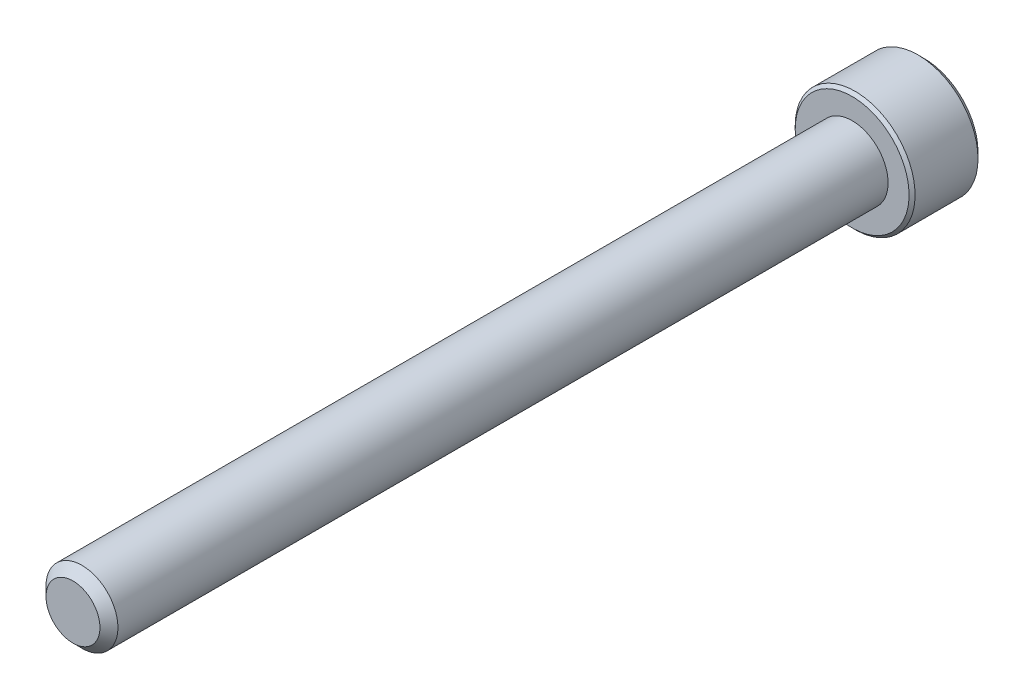
ISO-10303-21;
HEADER;
FILE_DESCRIPTION(('STEP AP214'),'2;1');
FILE_NAME('part.step','',(''),(''),'','','');
FILE_SCHEMA(('AUTOMOTIVE_DESIGN { 1 0 10303 214 1 1 1 1 }'));
ENDSEC;
DATA;
#1=APPLICATION_CONTEXT('core data for automotive mechanical design processes');
#2=APPLICATION_PROTOCOL_DEFINITION('international standard','automotive_design',2000,#1);
#3=PRODUCT_CONTEXT('',#1,'mechanical');
#4=PRODUCT('Part','Part','',(#3));
#5=PRODUCT_RELATED_PRODUCT_CATEGORY('part','',(#4));
#6=PRODUCT_DEFINITION_FORMATION('','',#4);
#7=PRODUCT_DEFINITION_CONTEXT('part definition',#1,'design');
#8=PRODUCT_DEFINITION('design','',#6,#7);
#9=PRODUCT_DEFINITION_SHAPE('','',#8);
#10=(LENGTH_UNIT() NAMED_UNIT(*) SI_UNIT(.MILLI.,.METRE.));
#11=(NAMED_UNIT(*) PLANE_ANGLE_UNIT() SI_UNIT($,.RADIAN.));
#12=(NAMED_UNIT(*) SI_UNIT($,.STERADIAN.) SOLID_ANGLE_UNIT());
#13=UNCERTAINTY_MEASURE_WITH_UNIT(LENGTH_MEASURE(1.E-05),#10,'distance_accuracy_value','');
#14=(GEOMETRIC_REPRESENTATION_CONTEXT(3) GLOBAL_UNCERTAINTY_ASSIGNED_CONTEXT((#13)) GLOBAL_UNIT_ASSIGNED_CONTEXT((#10,
#11,#12)) REPRESENTATION_CONTEXT('',''));
#15=CARTESIAN_POINT('',(0.,0.,0.));
#16=DIRECTION('',(0.,0.,1.));
#17=DIRECTION('',(1.,0.,0.));
#18=AXIS2_PLACEMENT_3D('',#15,#16,#17);
#19=CARTESIAN_POINT('',(0.,4.99999999999999,-35.5));
#20=DIRECTION('',(0.,0.,-1.));
#21=DIRECTION('',(1.,0.,0.));
#22=AXIS2_PLACEMENT_3D('',#19,#20,#21);
#23=PLANE('',#22);
#24=CARTESIAN_POINT('',(0.,0.,-35.5));
#25=DIRECTION('',(0.,0.,1.));
#26=DIRECTION('',(1.,0.,0.));
#27=AXIS2_PLACEMENT_3D('',#24,#25,#26);
#28=CIRCLE('',#27,4.49999999999999);
#29=CARTESIAN_POINT('',(4.49999999999999,0.,-35.5));
#30=VERTEX_POINT('',#29);
#31=EDGE_CURVE('E133',#30,#30,#28,.T.);
#32=ORIENTED_EDGE('',*,*,#31,.F.);
#33=EDGE_LOOP('',(#32));
#34=FACE_BOUND('',#33,.T.);
#35=DIRECTION('',(-0.866025403784439,0.5,0.));
#36=VECTOR('',#35,1.);
#37=CARTESIAN_POINT('',(2.5,1.44337567297406,-35.5));
#38=LINE('',#37,#36);
#39=CARTESIAN_POINT('',(2.5,1.44337567297406,-35.5));
#40=VERTEX_POINT('',#39);
#41=CARTESIAN_POINT('',(0.,2.88675134594813,-35.5));
#42=VERTEX_POINT('',#41);
#43=EDGE_CURVE('E292',#40,#42,#38,.T.);
#44=ORIENTED_EDGE('',*,*,#43,.T.);
#45=DIRECTION('',(-0.866025403784438,-0.5,0.));
#46=VECTOR('',#45,1.);
#47=CARTESIAN_POINT('',(0.,2.88675134594813,-35.5));
#48=LINE('',#47,#46);
#49=CARTESIAN_POINT('',(-2.5,1.44337567297406,-35.5));
#50=VERTEX_POINT('',#49);
#51=EDGE_CURVE('E286',#42,#50,#48,.T.);
#52=ORIENTED_EDGE('',*,*,#51,.T.);
#53=DIRECTION('',(0.,-1.,0.));
#54=VECTOR('',#53,1.);
#55=CARTESIAN_POINT('',(-2.5,1.44337567297406,-35.5));
#56=LINE('',#55,#54);
#57=CARTESIAN_POINT('',(-2.5,-1.44337567297407,-35.5));
#58=VERTEX_POINT('',#57);
#59=EDGE_CURVE('E291',#50,#58,#56,.T.);
#60=ORIENTED_EDGE('',*,*,#59,.T.);
#61=DIRECTION('',(0.866025403784439,-0.5,0.));
#62=VECTOR('',#61,1.);
#63=CARTESIAN_POINT('',(-2.5,-1.44337567297407,-35.5));
#64=LINE('',#63,#62);
#65=CARTESIAN_POINT('',(0.,-2.88675134594813,-35.5));
#66=VERTEX_POINT('',#65);
#67=EDGE_CURVE('E299',#58,#66,#64,.T.);
#68=ORIENTED_EDGE('',*,*,#67,.T.);
#69=DIRECTION('',(0.866025403784439,0.5,0.));
#70=VECTOR('',#69,1.);
#71=CARTESIAN_POINT('',(0.,-2.88675134594813,-35.5));
#72=LINE('',#71,#70);
#73=CARTESIAN_POINT('',(2.5,-1.44337567297407,-35.5));
#74=VERTEX_POINT('',#73);
#75=EDGE_CURVE('E116',#66,#74,#72,.T.);
#76=ORIENTED_EDGE('',*,*,#75,.T.);
#77=DIRECTION('',(0.,1.,0.));
#78=VECTOR('',#77,1.);
#79=CARTESIAN_POINT('',(2.5,-1.44337567297407,-35.5));
#80=LINE('',#79,#78);
#81=EDGE_CURVE('E294',#74,#40,#80,.T.);
#82=ORIENTED_EDGE('',*,*,#81,.T.);
#83=EDGE_LOOP('',(#44,#52,#60,#68,#76,#82));
#84=FACE_BOUND('',#83,.T.);
#85=ADVANCED_FACE('F37',(#34,#84),#23,.T.);
#86=CARTESIAN_POINT('',(0.,0.,35.5));
#87=DIRECTION('',(0.,0.,1.));
#88=DIRECTION('',(-1.,0.,0.));
#89=AXIS2_PLACEMENT_3D('',#86,#87,#88);
#90=CYLINDRICAL_SURFACE('',#89,5.);
#91=CARTESIAN_POINT('',(0.,0.,-29.75));
#92=DIRECTION('',(0.,0.,-1.));
#93=DIRECTION('',(-1.,0.,0.));
#94=AXIS2_PLACEMENT_3D('',#91,#92,#93);
#95=CIRCLE('',#94,5.);
#96=CARTESIAN_POINT('',(-5.,0.,-29.75));
#97=VERTEX_POINT('',#96);
#98=EDGE_CURVE('E139',#97,#97,#95,.F.);
#99=ORIENTED_EDGE('',*,*,#98,.F.);
#100=EDGE_LOOP('',(#99));
#101=FACE_BOUND('',#100,.T.);
#102=CARTESIAN_POINT('',(0.,0.,-35.));
#103=DIRECTION('',(0.,0.,1.));
#104=DIRECTION('',(1.,0.,0.));
#105=AXIS2_PLACEMENT_3D('',#102,#103,#104);
#106=CIRCLE('',#105,5.);
#107=CARTESIAN_POINT('',(5.,0.,-35.));
#108=VERTEX_POINT('',#107);
#109=EDGE_CURVE('E130',#108,#108,#106,.F.);
#110=ORIENTED_EDGE('',*,*,#109,.F.);
#111=EDGE_LOOP('',(#110));
#112=FACE_BOUND('',#111,.T.);
#113=ADVANCED_FACE('F160',(#101,#112),#90,.T.);
#114=CARTESIAN_POINT('',(0.,4.99999999999999,-29.5));
#115=DIRECTION('',(0.,0.,1.));
#116=DIRECTION('',(-1.,0.,0.));
#117=AXIS2_PLACEMENT_3D('',#114,#115,#116);
#118=PLANE('',#117);
#119=CARTESIAN_POINT('',(0.,0.,-29.5));
#120=DIRECTION('',(0.,0.,-1.));
#121=DIRECTION('',(-1.,0.,0.));
#122=AXIS2_PLACEMENT_3D('',#119,#120,#121);
#123=CIRCLE('',#122,4.74999999999998);
#124=CARTESIAN_POINT('',(-4.74999999999998,0.,-29.5));
#125=VERTEX_POINT('',#124);
#126=EDGE_CURVE('E136',#125,#125,#123,.T.);
#127=ORIENTED_EDGE('',*,*,#126,.F.);
#128=EDGE_LOOP('',(#127));
#129=FACE_BOUND('',#128,.T.);
#130=CARTESIAN_POINT('',(0.,0.,-29.5));
#131=DIRECTION('',(0.,0.,-1.));
#132=DIRECTION('',(-1.,0.,0.));
#133=AXIS2_PLACEMENT_3D('',#130,#131,#132);
#134=CIRCLE('',#133,3.);
#135=CARTESIAN_POINT('',(-3.,0.,-29.5));
#136=VERTEX_POINT('',#135);
#137=EDGE_CURVE('E127',#136,#136,#134,.T.);
#138=ORIENTED_EDGE('',*,*,#137,.T.);
#139=EDGE_LOOP('',(#138));
#140=FACE_BOUND('',#139,.T.);
#141=ADVANCED_FACE('F156',(#129,#140),#118,.T.);
#142=CARTESIAN_POINT('',(0.,0.,35.5));
#143=DIRECTION('',(0.,0.,1.));
#144=DIRECTION('',(-1.,0.,0.));
#145=AXIS2_PLACEMENT_3D('',#142,#143,#144);
#146=CYLINDRICAL_SURFACE('',#145,3.);
#147=CARTESIAN_POINT('',(0.,0.,34.75));
#148=DIRECTION('',(0.,0.,-1.));
#149=DIRECTION('',(-1.,0.,0.));
#150=AXIS2_PLACEMENT_3D('',#147,#148,#149);
#151=CIRCLE('',#150,3.);
#152=CARTESIAN_POINT('',(2.99999999999999,0.,34.75));
#153=VERTEX_POINT('',#152);
#154=EDGE_CURVE('E11',#153,#153,#151,.F.);
#155=ORIENTED_EDGE('',*,*,#154,.F.);
#156=EDGE_LOOP('',(#155));
#157=FACE_BOUND('',#156,.T.);
#158=ORIENTED_EDGE('',*,*,#137,.F.);
#159=EDGE_LOOP('',(#158));
#160=FACE_BOUND('',#159,.T.);
#161=ADVANCED_FACE('F148',(#157,#160),#146,.T.);
#162=CARTESIAN_POINT('',(0.,2.99999999999999,35.5));
#163=DIRECTION('',(0.,0.,1.));
#164=DIRECTION('',(-1.,0.,0.));
#165=AXIS2_PLACEMENT_3D('',#162,#163,#164);
#166=PLANE('',#165);
#167=CARTESIAN_POINT('',(0.,0.,35.5));
#168=DIRECTION('',(0.,0.,-1.));
#169=DIRECTION('',(-1.,0.,0.));
#170=AXIS2_PLACEMENT_3D('',#167,#168,#169);
#171=CIRCLE('',#170,2.25000000000001);
#172=CARTESIAN_POINT('',(2.25000000000001,0.,35.5));
#173=VERTEX_POINT('',#172);
#174=EDGE_CURVE('E45',#173,#173,#171,.T.);
#175=ORIENTED_EDGE('',*,*,#174,.F.);
#176=EDGE_LOOP('',(#175));
#177=FACE_BOUND('',#176,.T.);
#178=ADVANCED_FACE('F145',(#177),#166,.T.);
#179=CARTESIAN_POINT('',(2.5,1.44337567297406,-31.75));
#180=DIRECTION('',(0.5,0.866025403784439,0.));
#181=DIRECTION('',(-0.866025403784439,0.5,0.));
#182=AXIS2_PLACEMENT_3D('',#179,#180,#181);
#183=PLANE('',#182);
#184=ORIENTED_EDGE('',*,*,#43,.F.);
#185=DIRECTION('',(0.,0.,-1.));
#186=VECTOR('',#185,1.);
#187=CARTESIAN_POINT('',(2.5,1.44337567297406,-31.75));
#188=LINE('',#187,#186);
#189=CARTESIAN_POINT('',(2.5,1.44337567297406,-31.75));
#190=VERTEX_POINT('',#189);
#191=EDGE_CURVE('E83',#190,#40,#188,.T.);
#192=ORIENTED_EDGE('',*,*,#191,.F.);
#193=DIRECTION('',(-0.866025403784439,0.5,0.));
#194=VECTOR('',#193,1.);
#195=CARTESIAN_POINT('',(2.5,1.44337567297406,-31.75));
#196=LINE('',#195,#194);
#197=CARTESIAN_POINT('',(0.,2.88675134594813,-31.75));
#198=VERTEX_POINT('',#197);
#199=EDGE_CURVE('E302',#190,#198,#196,.T.);
#200=ORIENTED_EDGE('',*,*,#199,.T.);
#201=DIRECTION('',(0.,0.,-1.));
#202=VECTOR('',#201,1.);
#203=CARTESIAN_POINT('',(0.,2.88675134594813,-31.75));
#204=LINE('',#203,#202);
#205=EDGE_CURVE('E52',#198,#42,#204,.T.);
#206=ORIENTED_EDGE('',*,*,#205,.T.);
#207=EDGE_LOOP('',(#184,#192,#200,#206));
#208=FACE_BOUND('',#207,.T.);
#209=ADVANCED_FACE('F147',(#208),#183,.F.);
#210=CARTESIAN_POINT('',(2.5,-1.44337567297407,-31.75));
#211=DIRECTION('',(1.,0.,0.));
#212=DIRECTION('',(0.,0.,1.));
#213=AXIS2_PLACEMENT_3D('',#210,#211,#212);
#214=PLANE('',#213);
#215=ORIENTED_EDGE('',*,*,#81,.F.);
#216=DIRECTION('',(0.,0.,-1.));
#217=VECTOR('',#216,1.);
#218=CARTESIAN_POINT('',(2.5,-1.44337567297407,-31.75));
#219=LINE('',#218,#217);
#220=CARTESIAN_POINT('',(2.5,-1.44337567297407,-31.75));
#221=VERTEX_POINT('',#220);
#222=EDGE_CURVE('E118',#221,#74,#219,.T.);
#223=ORIENTED_EDGE('',*,*,#222,.F.);
#224=DIRECTION('',(0.,1.,0.));
#225=VECTOR('',#224,1.);
#226=CARTESIAN_POINT('',(2.5,-1.44337567297407,-31.75));
#227=LINE('',#226,#225);
#228=EDGE_CURVE('E61',#221,#190,#227,.T.);
#229=ORIENTED_EDGE('',*,*,#228,.T.);
#230=ORIENTED_EDGE('',*,*,#191,.T.);
#231=EDGE_LOOP('',(#215,#223,#229,#230));
#232=FACE_BOUND('',#231,.T.);
#233=ADVANCED_FACE('F154',(#232),#214,.F.);
#234=CARTESIAN_POINT('',(0.,-2.88675134594813,-31.75));
#235=DIRECTION('',(0.5,-0.866025403784439,0.));
#236=DIRECTION('',(0.866025403784439,0.5,0.));
#237=AXIS2_PLACEMENT_3D('',#234,#235,#236);
#238=PLANE('',#237);
#239=ORIENTED_EDGE('',*,*,#75,.F.);
#240=DIRECTION('',(0.,0.,-1.));
#241=VECTOR('',#240,1.);
#242=CARTESIAN_POINT('',(0.,-2.88675134594813,-31.75));
#243=LINE('',#242,#241);
#244=CARTESIAN_POINT('',(0.,-2.88675134594813,-31.75));
#245=VERTEX_POINT('',#244);
#246=EDGE_CURVE('E105',#245,#66,#243,.T.);
#247=ORIENTED_EDGE('',*,*,#246,.F.);
#248=DIRECTION('',(0.866025403784439,0.5,0.));
#249=VECTOR('',#248,1.);
#250=CARTESIAN_POINT('',(0.,-2.88675134594813,-31.75));
#251=LINE('',#250,#249);
#252=EDGE_CURVE('E108',#245,#221,#251,.T.);
#253=ORIENTED_EDGE('',*,*,#252,.T.);
#254=ORIENTED_EDGE('',*,*,#222,.T.);
#255=EDGE_LOOP('',(#239,#247,#253,#254));
#256=FACE_BOUND('',#255,.T.);
#257=ADVANCED_FACE('F114',(#256),#238,.F.);
#258=CARTESIAN_POINT('',(-2.5,-1.44337567297407,-31.75));
#259=DIRECTION('',(-0.5,-0.866025403784439,0.));
#260=DIRECTION('',(0.866025403784439,-0.5,0.));
#261=AXIS2_PLACEMENT_3D('',#258,#259,#260);
#262=PLANE('',#261);
#263=ORIENTED_EDGE('',*,*,#67,.F.);
#264=DIRECTION('',(0.,0.,-1.));
#265=VECTOR('',#264,1.);
#266=CARTESIAN_POINT('',(-2.5,-1.44337567297407,-31.75));
#267=LINE('',#266,#265);
#268=CARTESIAN_POINT('',(-2.5,-1.44337567297407,-31.75));
#269=VERTEX_POINT('',#268);
#270=EDGE_CURVE('E107',#269,#58,#267,.T.);
#271=ORIENTED_EDGE('',*,*,#270,.F.);
#272=DIRECTION('',(0.866025403784439,-0.5,0.));
#273=VECTOR('',#272,1.);
#274=CARTESIAN_POINT('',(-2.5,-1.44337567297407,-31.75));
#275=LINE('',#274,#273);
#276=EDGE_CURVE('E100',#269,#245,#275,.T.);
#277=ORIENTED_EDGE('',*,*,#276,.T.);
#278=ORIENTED_EDGE('',*,*,#246,.T.);
#279=EDGE_LOOP('',(#263,#271,#277,#278));
#280=FACE_BOUND('',#279,.T.);
#281=ADVANCED_FACE('F103',(#280),#262,.F.);
#282=CARTESIAN_POINT('',(-2.5,1.44337567297406,-31.75));
#283=DIRECTION('',(-1.,0.,0.));
#284=DIRECTION('',(0.,-1.,0.));
#285=AXIS2_PLACEMENT_3D('',#282,#283,#284);
#286=PLANE('',#285);
#287=ORIENTED_EDGE('',*,*,#59,.F.);
#288=DIRECTION('',(0.,0.,-1.));
#289=VECTOR('',#288,1.);
#290=CARTESIAN_POINT('',(-2.5,1.44337567297406,-31.75));
#291=LINE('',#290,#289);
#292=CARTESIAN_POINT('',(-2.5,1.44337567297406,-31.75));
#293=VERTEX_POINT('',#292);
#294=EDGE_CURVE('E121',#293,#50,#291,.T.);
#295=ORIENTED_EDGE('',*,*,#294,.F.);
#296=DIRECTION('',(0.,-1.,0.));
#297=VECTOR('',#296,1.);
#298=CARTESIAN_POINT('',(-2.5,1.44337567297406,-31.75));
#299=LINE('',#298,#297);
#300=EDGE_CURVE('E109',#293,#269,#299,.T.);
#301=ORIENTED_EDGE('',*,*,#300,.T.);
#302=ORIENTED_EDGE('',*,*,#270,.T.);
#303=EDGE_LOOP('',(#287,#295,#301,#302));
#304=FACE_BOUND('',#303,.T.);
#305=ADVANCED_FACE('F252',(#304),#286,.F.);
#306=CARTESIAN_POINT('',(0.,2.88675134594813,-31.75));
#307=DIRECTION('',(-0.5,0.866025403784438,0.));
#308=DIRECTION('',(-0.866025403784438,-0.5,0.));
#309=AXIS2_PLACEMENT_3D('',#306,#307,#308);
#310=PLANE('',#309);
#311=ORIENTED_EDGE('',*,*,#51,.F.);
#312=ORIENTED_EDGE('',*,*,#205,.F.);
#313=DIRECTION('',(-0.866025403784438,-0.5,0.));
#314=VECTOR('',#313,1.);
#315=CARTESIAN_POINT('',(0.,2.88675134594813,-31.75));
#316=LINE('',#315,#314);
#317=EDGE_CURVE('E91',#198,#293,#316,.T.);
#318=ORIENTED_EDGE('',*,*,#317,.T.);
#319=ORIENTED_EDGE('',*,*,#294,.T.);
#320=EDGE_LOOP('',(#311,#312,#318,#319));
#321=FACE_BOUND('',#320,.T.);
#322=ADVANCED_FACE('F260',(#321),#310,.F.);
#323=CARTESIAN_POINT('',(0.,0.,-31.75));
#324=DIRECTION('',(0.,0.,-1.));
#325=DIRECTION('',(1.,0.,0.));
#326=AXIS2_PLACEMENT_3D('',#323,#324,#325);
#327=PLANE('',#326);
#328=ORIENTED_EDGE('',*,*,#199,.F.);
#329=ORIENTED_EDGE('',*,*,#228,.F.);
#330=ORIENTED_EDGE('',*,*,#252,.F.);
#331=ORIENTED_EDGE('',*,*,#276,.F.);
#332=ORIENTED_EDGE('',*,*,#300,.F.);
#333=ORIENTED_EDGE('',*,*,#317,.F.);
#334=EDGE_LOOP('',(#328,#329,#330,#331,#332,#333));
#335=FACE_BOUND('',#334,.T.);
#336=ADVANCED_FACE('F111',(#335),#327,.T.);
#337=CARTESIAN_POINT('',(0.,0.,-35.));
#338=DIRECTION('',(0.,0.,1.));
#339=DIRECTION('',(-1.,0.,0.));
#340=AXIS2_PLACEMENT_3D('',#337,#338,#339);
#341=CONICAL_SURFACE('',#340,5.,0.785398163397454);
#342=ORIENTED_EDGE('',*,*,#31,.T.);
#343=EDGE_LOOP('',(#342));
#344=FACE_BOUND('',#343,.T.);
#345=ORIENTED_EDGE('',*,*,#109,.T.);
#346=EDGE_LOOP('',(#345));
#347=FACE_BOUND('',#346,.T.);
#348=ADVANCED_FACE('F172',(#344,#347),#341,.T.);
#349=CARTESIAN_POINT('',(0.,0.,-29.5));
#350=DIRECTION('',(0.,0.,-1.));
#351=DIRECTION('',(1.,0.,0.));
#352=AXIS2_PLACEMENT_3D('',#349,#350,#351);
#353=CONICAL_SURFACE('',#352,4.74999999999998,0.785398163397445);
#354=ORIENTED_EDGE('',*,*,#98,.T.);
#355=EDGE_LOOP('',(#354));
#356=FACE_BOUND('',#355,.T.);
#357=ORIENTED_EDGE('',*,*,#126,.T.);
#358=EDGE_LOOP('',(#357));
#359=FACE_BOUND('',#358,.T.);
#360=ADVANCED_FACE('F174',(#356,#359),#353,.T.);
#361=CARTESIAN_POINT('',(0.,0.,35.5));
#362=DIRECTION('',(0.,0.,-1.));
#363=DIRECTION('',(1.,0.,0.));
#364=AXIS2_PLACEMENT_3D('',#361,#362,#363);
#365=CONICAL_SURFACE('',#364,2.25000000000001,0.785398163397444);
#366=CARTESIAN_POINT('',(2.99999999999999,0.,34.75));
#367=CARTESIAN_POINT('',(2.99218749999999,0.,34.7578125));
#368=CARTESIAN_POINT('',(2.98437499999999,0.,34.765625));
#369=CARTESIAN_POINT('',(2.96874999999999,0.,34.78125));
#370=CARTESIAN_POINT('',(2.96093749999999,0.,34.7890625));
#371=CARTESIAN_POINT('',(2.94531249999999,0.,34.8046875));
#372=CARTESIAN_POINT('',(2.93749999999999,0.,34.8125));
#373=CARTESIAN_POINT('',(2.92187499999999,0.,34.828125));
#374=CARTESIAN_POINT('',(2.91406249999999,0.,34.8359375));
#375=CARTESIAN_POINT('',(2.89843749999999,0.,34.8515625));
#376=CARTESIAN_POINT('',(2.89062499999999,0.,34.859375));
#377=CARTESIAN_POINT('',(2.875,0.,34.875));
#378=CARTESIAN_POINT('',(2.8671875,0.,34.8828125));
#379=CARTESIAN_POINT('',(2.8515625,0.,34.8984375));
#380=CARTESIAN_POINT('',(2.84375,0.,34.90625));
#381=CARTESIAN_POINT('',(2.828125,0.,34.921875));
#382=CARTESIAN_POINT('',(2.8203125,0.,34.9296875));
#383=CARTESIAN_POINT('',(2.8046875,0.,34.9453125));
#384=CARTESIAN_POINT('',(2.796875,0.,34.953125));
#385=CARTESIAN_POINT('',(2.78125,0.,34.96875));
#386=CARTESIAN_POINT('',(2.7734375,0.,34.9765625));
#387=CARTESIAN_POINT('',(2.7578125,0.,34.9921875));
#388=CARTESIAN_POINT('',(2.75,0.,35.));
#389=CARTESIAN_POINT('',(2.734375,0.,35.015625));
#390=CARTESIAN_POINT('',(2.7265625,0.,35.0234375));
#391=CARTESIAN_POINT('',(2.7109375,0.,35.0390625));
#392=CARTESIAN_POINT('',(2.703125,0.,35.046875));
#393=CARTESIAN_POINT('',(2.6875,0.,35.0625));
#394=CARTESIAN_POINT('',(2.6796875,0.,35.0703125));
#395=CARTESIAN_POINT('',(2.6640625,0.,35.0859375));
#396=CARTESIAN_POINT('',(2.65625,0.,35.09375));
#397=CARTESIAN_POINT('',(2.640625,0.,35.109375));
#398=CARTESIAN_POINT('',(2.6328125,0.,35.1171875));
#399=CARTESIAN_POINT('',(2.6171875,0.,35.1328125));
#400=CARTESIAN_POINT('',(2.609375,0.,35.140625));
#401=CARTESIAN_POINT('',(2.59375,0.,35.15625));
#402=CARTESIAN_POINT('',(2.5859375,0.,35.1640625));
#403=CARTESIAN_POINT('',(2.5703125,0.,35.1796875));
#404=CARTESIAN_POINT('',(2.5625,0.,35.1875));
#405=CARTESIAN_POINT('',(2.546875,0.,35.203125));
#406=CARTESIAN_POINT('',(2.5390625,0.,35.2109375));
#407=CARTESIAN_POINT('',(2.5234375,0.,35.2265625));
#408=CARTESIAN_POINT('',(2.515625,0.,35.234375));
#409=CARTESIAN_POINT('',(2.5,0.,35.25));
#410=CARTESIAN_POINT('',(2.4921875,0.,35.2578125));
#411=CARTESIAN_POINT('',(2.4765625,0.,35.2734375));
#412=CARTESIAN_POINT('',(2.46875,0.,35.28125));
#413=CARTESIAN_POINT('',(2.453125,0.,35.296875));
#414=CARTESIAN_POINT('',(2.4453125,0.,35.3046875));
#415=CARTESIAN_POINT('',(2.4296875,0.,35.3203125));
#416=CARTESIAN_POINT('',(2.421875,0.,35.328125));
#417=CARTESIAN_POINT('',(2.40625,0.,35.34375));
#418=CARTESIAN_POINT('',(2.3984375,0.,35.3515625));
#419=CARTESIAN_POINT('',(2.3828125,0.,35.3671875));
#420=CARTESIAN_POINT('',(2.375,0.,35.375));
#421=CARTESIAN_POINT('',(2.359375,0.,35.390625));
#422=CARTESIAN_POINT('',(2.3515625,0.,35.3984375));
#423=CARTESIAN_POINT('',(2.3359375,0.,35.4140625));
#424=CARTESIAN_POINT('',(2.328125,0.,35.421875));
#425=CARTESIAN_POINT('',(2.3125,0.,35.4375));
#426=CARTESIAN_POINT('',(2.3046875,0.,35.4453125));
#427=CARTESIAN_POINT('',(2.2890625,0.,35.4609375));
#428=CARTESIAN_POINT('',(2.28125,0.,35.46875));
#429=CARTESIAN_POINT('',(2.26562500000001,0.,35.484375));
#430=CARTESIAN_POINT('',(2.25781250000001,0.,35.4921875));
#431=CARTESIAN_POINT('',(2.25000000000001,0.,35.5));
#432=B_SPLINE_CURVE_WITH_KNOTS('',3,(#366,#367,#368,#369,#370,#371,#372,#373,#374,#375,#376,
#377,#378,#379,#380,#381,#382,#383,#384,#385,#386,#387,#388,#389,#390,#391,#392,#393,#394,#395,
#396,#397,#398,#399,#400,#401,#402,#403,#404,#405,#406,#407,#408,#409,#410,#411,#412,#413,#414,
#415,#416,#417,#418,#419,#420,#421,#422,#423,#424,#425,#426,#427,#428,#429,#430,#431),
.UNSPECIFIED.,.F.,.F.,(4,2,2,2,2,2,2,2,2,2,2,2,2,2,2,2,2,2,2,2,2,2,2,2,2,2,2,2,2,2,2,2,4),(0.,
0.0331456303681198,0.0662912607362395,0.0994368911043592,0.132582521472479,0.165728151840599,
0.198873782208719,0.232019412576833,0.265165042944953,0.298310673313073,0.331456303681193,
0.364601934049312,0.397747564417432,0.430893194785547,0.464038825153667,0.497184455521787,
0.530330085889906,0.563475716258026,0.596621346626146,0.629766976994266,0.662912607362381,
0.6960582377305,0.72920386809862,0.76234949846674,0.79549512883486,0.82864075920298,
0.861786389571094,0.894932019939214,0.928077650307334,0.961223280675454,0.994368911043573,
1.02751454141169,1.06066017177981),.UNSPECIFIED.);
#433=EDGE_CURVE('BSEAM39',#153,#173,#432,.T.);
#434=ORIENTED_EDGE('',*,*,#154,.T.);
#435=ORIENTED_EDGE('',*,*,#174,.T.);
#436=ORIENTED_EDGE('',*,*,#433,.T.);
#437=ORIENTED_EDGE('',*,*,#433,.F.);
#438=EDGE_LOOP('',(#434,#436,#435,#437));
#439=FACE_BOUND('',#438,.T.);
#440=ADVANCED_FACE('F39',(#439),#365,.T.);
#441=CLOSED_SHELL('',(#85,#113,#141,#161,#178,#209,#233,#257,#281,#305,#322,#336,#348,#360,#440));
#442=MANIFOLD_SOLID_BREP('B2',#441);
#443=ADVANCED_BREP_SHAPE_REPRESENTATION('',(#18,#442),#14);
#444=SHAPE_DEFINITION_REPRESENTATION(#9,#443);
ENDSEC;
END-ISO-10303-21;
